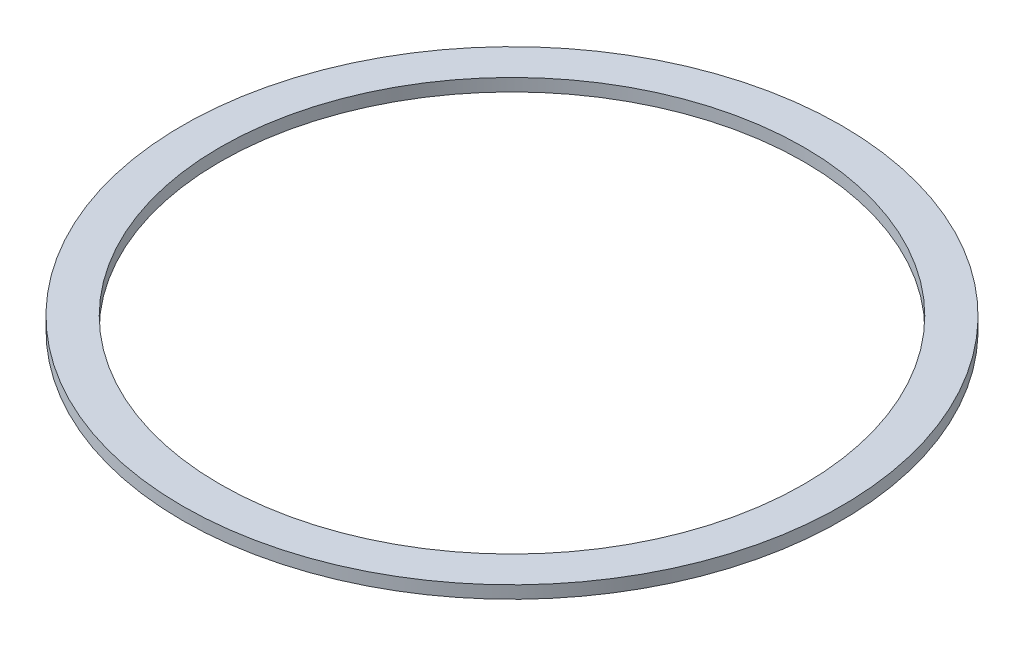
ISO-10303-21;
HEADER;
FILE_DESCRIPTION(('STEP AP214'),'2;1');
FILE_NAME('part.step','',(''),(''),'','','');
FILE_SCHEMA(('AUTOMOTIVE_DESIGN { 1 0 10303 214 1 1 1 1 }'));
ENDSEC;
DATA;
#1=APPLICATION_CONTEXT('core data for automotive mechanical design processes');
#2=APPLICATION_PROTOCOL_DEFINITION('international standard','automotive_design',2000,#1);
#3=PRODUCT_CONTEXT('',#1,'mechanical');
#4=PRODUCT('Part','Part','',(#3));
#5=PRODUCT_RELATED_PRODUCT_CATEGORY('part','',(#4));
#6=PRODUCT_DEFINITION_FORMATION('','',#4);
#7=PRODUCT_DEFINITION_CONTEXT('part definition',#1,'design');
#8=PRODUCT_DEFINITION('design','',#6,#7);
#9=PRODUCT_DEFINITION_SHAPE('','',#8);
#10=(LENGTH_UNIT() NAMED_UNIT(*) SI_UNIT(.MILLI.,.METRE.));
#11=(NAMED_UNIT(*) PLANE_ANGLE_UNIT() SI_UNIT($,.RADIAN.));
#12=(NAMED_UNIT(*) SI_UNIT($,.STERADIAN.) SOLID_ANGLE_UNIT());
#13=UNCERTAINTY_MEASURE_WITH_UNIT(LENGTH_MEASURE(1.E-05),#10,'distance_accuracy_value','');
#14=(GEOMETRIC_REPRESENTATION_CONTEXT(3) GLOBAL_UNCERTAINTY_ASSIGNED_CONTEXT((#13)) GLOBAL_UNIT_ASSIGNED_CONTEXT((#10,
#11,#12)) REPRESENTATION_CONTEXT('',''));
#15=CARTESIAN_POINT('',(0.,0.,0.));
#16=DIRECTION('',(0.,0.,1.));
#17=DIRECTION('',(1.,0.,0.));
#18=AXIS2_PLACEMENT_3D('',#15,#16,#17);
#19=CARTESIAN_POINT('',(0.,2.,0.));
#20=DIRECTION('',(0.,1.,0.));
#21=DIRECTION('',(0.,0.,1.));
#22=AXIS2_PLACEMENT_3D('',#19,#20,#21);
#23=PLANE('',#22);
#24=CARTESIAN_POINT('',(0.,2.,0.));
#25=DIRECTION('',(0.,1.,0.));
#26=DIRECTION('',(0.,0.,1.));
#27=AXIS2_PLACEMENT_3D('',#24,#25,#26);
#28=CIRCLE('',#27,52.5);
#29=CARTESIAN_POINT('',(0.,2.,52.5));
#30=VERTEX_POINT('',#29);
#31=EDGE_CURVE('E10',#30,#30,#28,.T.);
#32=ORIENTED_EDGE('',*,*,#31,.T.);
#33=EDGE_LOOP('',(#32));
#34=FACE_BOUND('',#33,.T.);
#35=CARTESIAN_POINT('',(0.,2.,0.));
#36=DIRECTION('',(0.,1.,0.));
#37=DIRECTION('',(0.,0.,1.));
#38=AXIS2_PLACEMENT_3D('',#35,#36,#37);
#39=CIRCLE('',#38,46.5);
#40=CARTESIAN_POINT('',(0.,2.,46.5));
#41=VERTEX_POINT('',#40);
#42=EDGE_CURVE('E44',#41,#41,#39,.T.);
#43=ORIENTED_EDGE('',*,*,#42,.F.);
#44=EDGE_LOOP('',(#43));
#45=FACE_BOUND('',#44,.T.);
#46=ADVANCED_FACE('F33',(#34,#45),#23,.T.);
#47=CARTESIAN_POINT('',(0.,0.,0.));
#48=DIRECTION('',(0.,1.,0.));
#49=DIRECTION('',(0.,0.,1.));
#50=AXIS2_PLACEMENT_3D('',#47,#48,#49);
#51=PLANE('',#50);
#52=CARTESIAN_POINT('',(0.,0.,0.));
#53=DIRECTION('',(0.,1.,0.));
#54=DIRECTION('',(0.,0.,1.));
#55=AXIS2_PLACEMENT_3D('',#52,#53,#54);
#56=CIRCLE('',#55,52.5);
#57=CARTESIAN_POINT('',(0.,0.,52.5));
#58=VERTEX_POINT('',#57);
#59=EDGE_CURVE('E37',#58,#58,#56,.T.);
#60=ORIENTED_EDGE('',*,*,#59,.F.);
#61=EDGE_LOOP('',(#60));
#62=FACE_BOUND('',#61,.T.);
#63=CARTESIAN_POINT('',(0.,0.,0.));
#64=DIRECTION('',(0.,1.,0.));
#65=DIRECTION('',(0.,0.,1.));
#66=AXIS2_PLACEMENT_3D('',#63,#64,#65);
#67=CIRCLE('',#66,46.5);
#68=CARTESIAN_POINT('',(0.,0.,46.5));
#69=VERTEX_POINT('',#68);
#70=EDGE_CURVE('E46',#69,#69,#67,.T.);
#71=ORIENTED_EDGE('',*,*,#70,.T.);
#72=EDGE_LOOP('',(#71));
#73=FACE_BOUND('',#72,.T.);
#74=ADVANCED_FACE('F56',(#62,#73),#51,.F.);
#75=CARTESIAN_POINT('',(0.,2.,0.));
#76=DIRECTION('',(0.,-1.,0.));
#77=DIRECTION('',(0.,0.,-1.));
#78=AXIS2_PLACEMENT_3D('',#75,#76,#77);
#79=CYLINDRICAL_SURFACE('',#78,52.5);
#80=ORIENTED_EDGE('',*,*,#31,.F.);
#81=EDGE_LOOP('',(#80));
#82=FACE_BOUND('',#81,.T.);
#83=ORIENTED_EDGE('',*,*,#59,.T.);
#84=EDGE_LOOP('',(#83));
#85=FACE_BOUND('',#84,.T.);
#86=ADVANCED_FACE('F35',(#82,#85),#79,.T.);
#87=CARTESIAN_POINT('',(0.,2.,0.));
#88=DIRECTION('',(0.,-1.,0.));
#89=DIRECTION('',(0.,0.,-1.));
#90=AXIS2_PLACEMENT_3D('',#87,#88,#89);
#91=CYLINDRICAL_SURFACE('',#90,46.5);
#92=ORIENTED_EDGE('',*,*,#42,.T.);
#93=EDGE_LOOP('',(#92));
#94=FACE_BOUND('',#93,.T.);
#95=ORIENTED_EDGE('',*,*,#70,.F.);
#96=EDGE_LOOP('',(#95));
#97=FACE_BOUND('',#96,.T.);
#98=ADVANCED_FACE('F52',(#94,#97),#91,.F.);
#99=CLOSED_SHELL('',(#46,#74,#86,#98));
#100=MANIFOLD_SOLID_BREP('B2',#99);
#101=ADVANCED_BREP_SHAPE_REPRESENTATION('',(#18,#100),#14);
#102=SHAPE_DEFINITION_REPRESENTATION(#9,#101);
ENDSEC;
END-ISO-10303-21;
